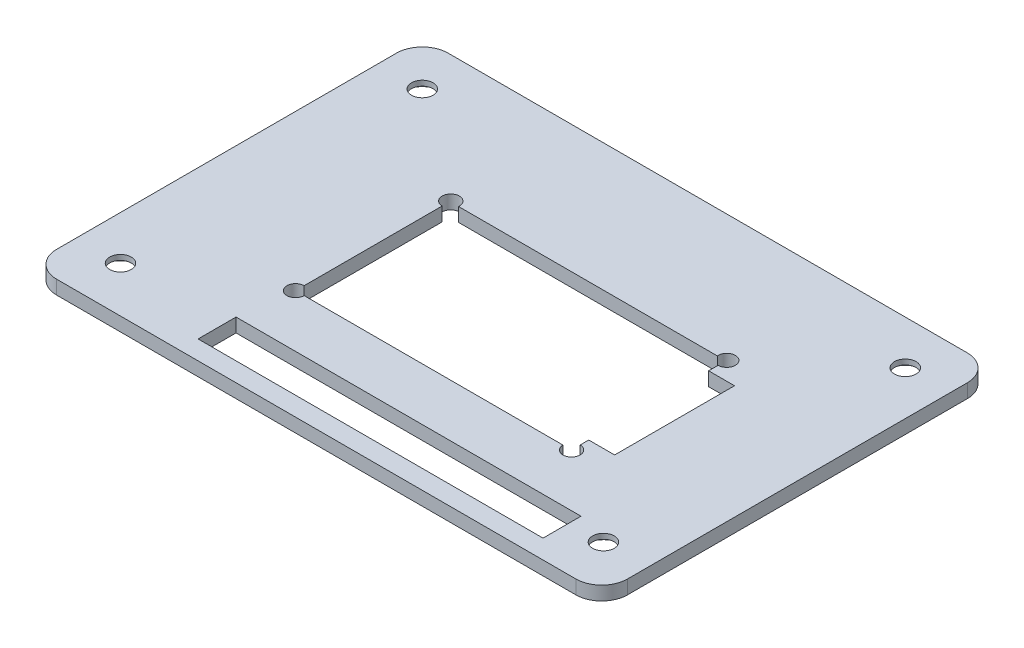
ISO-10303-21;
HEADER;
FILE_DESCRIPTION(('STEP AP214'),'2;1');
FILE_NAME('part.step','',(''),(''),'','','');
FILE_SCHEMA(('AUTOMOTIVE_DESIGN { 1 0 10303 214 1 1 1 1 }'));
ENDSEC;
DATA;
#1=APPLICATION_CONTEXT('core data for automotive mechanical design processes');
#2=APPLICATION_PROTOCOL_DEFINITION('international standard','automotive_design',2000,#1);
#3=PRODUCT_CONTEXT('',#1,'mechanical');
#4=PRODUCT('Part','Part','',(#3));
#5=PRODUCT_RELATED_PRODUCT_CATEGORY('part','',(#4));
#6=PRODUCT_DEFINITION_FORMATION('','',#4);
#7=PRODUCT_DEFINITION_CONTEXT('part definition',#1,'design');
#8=PRODUCT_DEFINITION('design','',#6,#7);
#9=PRODUCT_DEFINITION_SHAPE('','',#8);
#10=(LENGTH_UNIT() NAMED_UNIT(*) SI_UNIT(.MILLI.,.METRE.));
#11=(NAMED_UNIT(*) PLANE_ANGLE_UNIT() SI_UNIT($,.RADIAN.));
#12=(NAMED_UNIT(*) SI_UNIT($,.STERADIAN.) SOLID_ANGLE_UNIT());
#13=UNCERTAINTY_MEASURE_WITH_UNIT(LENGTH_MEASURE(1.E-05),#10,'distance_accuracy_value','');
#14=(GEOMETRIC_REPRESENTATION_CONTEXT(3) GLOBAL_UNCERTAINTY_ASSIGNED_CONTEXT((#13)) GLOBAL_UNIT_ASSIGNED_CONTEXT((#10,
#11,#12)) REPRESENTATION_CONTEXT('',''));
#15=CARTESIAN_POINT('',(0.,0.,0.));
#16=DIRECTION('',(0.,0.,1.));
#17=DIRECTION('',(1.,0.,0.));
#18=AXIS2_PLACEMENT_3D('',#15,#16,#17);
#19=CARTESIAN_POINT('',(30.1,1.6,-19.7));
#20=DIRECTION('',(0.,-1.,0.));
#21=DIRECTION('',(0.,0.,-1.));
#22=AXIS2_PLACEMENT_3D('',#19,#20,#21);
#23=CYLINDRICAL_SURFACE('',#22,3.);
#24=CARTESIAN_POINT('',(30.1,0.,-19.7));
#25=DIRECTION('',(0.,1.,0.));
#26=DIRECTION('',(0.,0.,-1.));
#27=AXIS2_PLACEMENT_3D('',#24,#25,#26);
#28=CIRCLE('',#27,3.);
#29=CARTESIAN_POINT('',(33.1,0.,-19.7));
#30=VERTEX_POINT('',#29);
#31=CARTESIAN_POINT('',(30.1,0.,-22.7));
#32=VERTEX_POINT('',#31);
#33=EDGE_CURVE('E351',#30,#32,#28,.T.);
#34=ORIENTED_EDGE('',*,*,#33,.T.);
#35=DIRECTION('',(0.,-1.,0.));
#36=VECTOR('',#35,1.);
#37=CARTESIAN_POINT('',(30.1,1.6,-22.7));
#38=LINE('',#37,#36);
#39=CARTESIAN_POINT('',(30.1,1.6,-22.7));
#40=VERTEX_POINT('',#39);
#41=EDGE_CURVE('E11',#40,#32,#38,.T.);
#42=ORIENTED_EDGE('',*,*,#41,.F.);
#43=CARTESIAN_POINT('',(30.1,1.6,-19.7));
#44=DIRECTION('',(0.,1.,0.));
#45=DIRECTION('',(0.,0.,-1.));
#46=AXIS2_PLACEMENT_3D('',#43,#44,#45);
#47=CIRCLE('',#46,3.);
#48=CARTESIAN_POINT('',(33.1,1.6,-19.7));
#49=VERTEX_POINT('',#48);
#50=EDGE_CURVE('E354',#49,#40,#47,.T.);
#51=ORIENTED_EDGE('',*,*,#50,.F.);
#52=DIRECTION('',(0.,-1.,0.));
#53=VECTOR('',#52,1.);
#54=CARTESIAN_POINT('',(33.1,1.6,-19.7));
#55=LINE('',#54,#53);
#56=EDGE_CURVE('E372',#49,#30,#55,.T.);
#57=ORIENTED_EDGE('',*,*,#56,.T.);
#58=EDGE_LOOP('',(#34,#42,#51,#57));
#59=FACE_BOUND('',#58,.T.);
#60=ADVANCED_FACE('F33',(#59),#23,.T.);
#61=CARTESIAN_POINT('',(-30.1,1.6,-22.7));
#62=DIRECTION('',(0.,0.,1.));
#63=DIRECTION('',(1.,0.,0.));
#64=AXIS2_PLACEMENT_3D('',#61,#62,#63);
#65=PLANE('',#64);
#66=DIRECTION('',(-1.,0.,0.));
#67=VECTOR('',#66,1.);
#68=CARTESIAN_POINT('',(-30.1,0.,-22.7));
#69=LINE('',#68,#67);
#70=CARTESIAN_POINT('',(-30.1,0.,-22.7));
#71=VERTEX_POINT('',#70);
#72=EDGE_CURVE('E375',#32,#71,#69,.T.);
#73=ORIENTED_EDGE('',*,*,#72,.T.);
#74=DIRECTION('',(0.,-1.,0.));
#75=VECTOR('',#74,1.);
#76=CARTESIAN_POINT('',(-30.1,1.6,-22.7));
#77=LINE('',#76,#75);
#78=CARTESIAN_POINT('',(-30.1,1.6,-22.7));
#79=VERTEX_POINT('',#78);
#80=EDGE_CURVE('E40',#79,#71,#77,.T.);
#81=ORIENTED_EDGE('',*,*,#80,.F.);
#82=DIRECTION('',(-1.,0.,0.));
#83=VECTOR('',#82,1.);
#84=CARTESIAN_POINT('',(-30.1,1.6,-22.7));
#85=LINE('',#84,#83);
#86=EDGE_CURVE('E357',#40,#79,#85,.T.);
#87=ORIENTED_EDGE('',*,*,#86,.F.);
#88=ORIENTED_EDGE('',*,*,#41,.T.);
#89=EDGE_LOOP('',(#73,#81,#87,#88));
#90=FACE_BOUND('',#89,.T.);
#91=ADVANCED_FACE('F431',(#90),#65,.F.);
#92=CARTESIAN_POINT('',(-30.1,1.6,-19.7));
#93=DIRECTION('',(0.,-1.,0.));
#94=DIRECTION('',(0.,0.,-1.));
#95=AXIS2_PLACEMENT_3D('',#92,#93,#94);
#96=CYLINDRICAL_SURFACE('',#95,3.);
#97=CARTESIAN_POINT('',(-30.1,0.,-19.7));
#98=DIRECTION('',(0.,1.,0.));
#99=DIRECTION('',(0.,0.,-1.));
#100=AXIS2_PLACEMENT_3D('',#97,#98,#99);
#101=CIRCLE('',#100,3.);
#102=CARTESIAN_POINT('',(-33.1,0.,-19.7));
#103=VERTEX_POINT('',#102);
#104=EDGE_CURVE('E377',#71,#103,#101,.T.);
#105=ORIENTED_EDGE('',*,*,#104,.T.);
#106=DIRECTION('',(0.,-1.,0.));
#107=VECTOR('',#106,1.);
#108=CARTESIAN_POINT('',(-33.1,1.6,-19.7));
#109=LINE('',#108,#107);
#110=CARTESIAN_POINT('',(-33.1,1.6,-19.7));
#111=VERTEX_POINT('',#110);
#112=EDGE_CURVE('E402',#111,#103,#109,.T.);
#113=ORIENTED_EDGE('',*,*,#112,.F.);
#114=CARTESIAN_POINT('',(-30.1,1.6,-19.7));
#115=DIRECTION('',(0.,1.,0.));
#116=DIRECTION('',(0.,0.,-1.));
#117=AXIS2_PLACEMENT_3D('',#114,#115,#116);
#118=CIRCLE('',#117,3.);
#119=EDGE_CURVE('E360',#79,#111,#118,.T.);
#120=ORIENTED_EDGE('',*,*,#119,.F.);
#121=ORIENTED_EDGE('',*,*,#80,.T.);
#122=EDGE_LOOP('',(#105,#113,#120,#121));
#123=FACE_BOUND('',#122,.T.);
#124=ADVANCED_FACE('F409',(#123),#96,.T.);
#125=CARTESIAN_POINT('',(-33.1,1.6,19.7));
#126=DIRECTION('',(1.,0.,0.));
#127=DIRECTION('',(0.,0.,-1.));
#128=AXIS2_PLACEMENT_3D('',#125,#126,#127);
#129=PLANE('',#128);
#130=DIRECTION('',(0.,0.,1.));
#131=VECTOR('',#130,1.);
#132=CARTESIAN_POINT('',(-33.1,0.,19.7));
#133=LINE('',#132,#131);
#134=CARTESIAN_POINT('',(-33.1,0.,19.7));
#135=VERTEX_POINT('',#134);
#136=EDGE_CURVE('E379',#103,#135,#133,.T.);
#137=ORIENTED_EDGE('',*,*,#136,.T.);
#138=DIRECTION('',(0.,-1.,0.));
#139=VECTOR('',#138,1.);
#140=CARTESIAN_POINT('',(-33.1,1.6,19.7));
#141=LINE('',#140,#139);
#142=CARTESIAN_POINT('',(-33.1,1.6,19.7));
#143=VERTEX_POINT('',#142);
#144=EDGE_CURVE('E399',#143,#135,#141,.T.);
#145=ORIENTED_EDGE('',*,*,#144,.F.);
#146=DIRECTION('',(0.,0.,1.));
#147=VECTOR('',#146,1.);
#148=CARTESIAN_POINT('',(-33.1,1.6,19.7));
#149=LINE('',#148,#147);
#150=EDGE_CURVE('E362',#111,#143,#149,.T.);
#151=ORIENTED_EDGE('',*,*,#150,.F.);
#152=ORIENTED_EDGE('',*,*,#112,.T.);
#153=EDGE_LOOP('',(#137,#145,#151,#152));
#154=FACE_BOUND('',#153,.T.);
#155=ADVANCED_FACE('F420',(#154),#129,.F.);
#156=CARTESIAN_POINT('',(-30.1,1.6,19.7));
#157=DIRECTION('',(0.,-1.,0.));
#158=DIRECTION('',(0.,0.,-1.));
#159=AXIS2_PLACEMENT_3D('',#156,#157,#158);
#160=CYLINDRICAL_SURFACE('',#159,3.);
#161=CARTESIAN_POINT('',(-30.1,0.,19.7));
#162=DIRECTION('',(0.,1.,0.));
#163=DIRECTION('',(0.,0.,-1.));
#164=AXIS2_PLACEMENT_3D('',#161,#162,#163);
#165=CIRCLE('',#164,3.);
#166=CARTESIAN_POINT('',(-30.1,0.,22.7));
#167=VERTEX_POINT('',#166);
#168=EDGE_CURVE('E381',#135,#167,#165,.T.);
#169=ORIENTED_EDGE('',*,*,#168,.T.);
#170=DIRECTION('',(0.,-1.,0.));
#171=VECTOR('',#170,1.);
#172=CARTESIAN_POINT('',(-30.1,1.6,22.7));
#173=LINE('',#172,#171);
#174=CARTESIAN_POINT('',(-30.1,1.6,22.7));
#175=VERTEX_POINT('',#174);
#176=EDGE_CURVE('E396',#175,#167,#173,.T.);
#177=ORIENTED_EDGE('',*,*,#176,.F.);
#178=CARTESIAN_POINT('',(-30.1,1.6,19.7));
#179=DIRECTION('',(0.,1.,0.));
#180=DIRECTION('',(0.,0.,-1.));
#181=AXIS2_PLACEMENT_3D('',#178,#179,#180);
#182=CIRCLE('',#181,3.);
#183=EDGE_CURVE('E364',#143,#175,#182,.T.);
#184=ORIENTED_EDGE('',*,*,#183,.F.);
#185=ORIENTED_EDGE('',*,*,#144,.T.);
#186=EDGE_LOOP('',(#169,#177,#184,#185));
#187=FACE_BOUND('',#186,.T.);
#188=ADVANCED_FACE('F424',(#187),#160,.T.);
#189=CARTESIAN_POINT('',(-30.1,1.6,22.7));
#190=DIRECTION('',(0.,0.,-1.));
#191=DIRECTION('',(-1.,0.,0.));
#192=AXIS2_PLACEMENT_3D('',#189,#190,#191);
#193=PLANE('',#192);
#194=DIRECTION('',(1.,0.,0.));
#195=VECTOR('',#194,1.);
#196=CARTESIAN_POINT('',(-30.1,0.,22.7));
#197=LINE('',#196,#195);
#198=CARTESIAN_POINT('',(30.1,0.,22.7));
#199=VERTEX_POINT('',#198);
#200=EDGE_CURVE('E383',#167,#199,#197,.T.);
#201=ORIENTED_EDGE('',*,*,#200,.T.);
#202=DIRECTION('',(0.,-1.,0.));
#203=VECTOR('',#202,1.);
#204=CARTESIAN_POINT('',(30.1,1.6,22.7));
#205=LINE('',#204,#203);
#206=CARTESIAN_POINT('',(30.1,1.6,22.7));
#207=VERTEX_POINT('',#206);
#208=EDGE_CURVE('E393',#207,#199,#205,.T.);
#209=ORIENTED_EDGE('',*,*,#208,.F.);
#210=DIRECTION('',(1.,0.,0.));
#211=VECTOR('',#210,1.);
#212=CARTESIAN_POINT('',(-30.1,1.6,22.7));
#213=LINE('',#212,#211);
#214=EDGE_CURVE('E366',#175,#207,#213,.T.);
#215=ORIENTED_EDGE('',*,*,#214,.F.);
#216=ORIENTED_EDGE('',*,*,#176,.T.);
#217=EDGE_LOOP('',(#201,#209,#215,#216));
#218=FACE_BOUND('',#217,.T.);
#219=ADVANCED_FACE('F444',(#218),#193,.F.);
#220=CARTESIAN_POINT('',(30.1,1.6,19.7));
#221=DIRECTION('',(0.,-1.,0.));
#222=DIRECTION('',(0.,0.,-1.));
#223=AXIS2_PLACEMENT_3D('',#220,#221,#222);
#224=CYLINDRICAL_SURFACE('',#223,3.);
#225=CARTESIAN_POINT('',(30.1,0.,19.7));
#226=DIRECTION('',(0.,1.,0.));
#227=DIRECTION('',(0.,0.,1.));
#228=AXIS2_PLACEMENT_3D('',#225,#226,#227);
#229=CIRCLE('',#228,3.);
#230=CARTESIAN_POINT('',(33.1,0.,19.7));
#231=VERTEX_POINT('',#230);
#232=EDGE_CURVE('E385',#199,#231,#229,.T.);
#233=ORIENTED_EDGE('',*,*,#232,.T.);
#234=DIRECTION('',(0.,-1.,0.));
#235=VECTOR('',#234,1.);
#236=CARTESIAN_POINT('',(33.1,1.6,19.7));
#237=LINE('',#236,#235);
#238=CARTESIAN_POINT('',(33.1,1.6,19.7));
#239=VERTEX_POINT('',#238);
#240=EDGE_CURVE('E390',#239,#231,#237,.T.);
#241=ORIENTED_EDGE('',*,*,#240,.F.);
#242=CARTESIAN_POINT('',(30.1,1.6,19.7));
#243=DIRECTION('',(0.,1.,0.));
#244=DIRECTION('',(0.,0.,1.));
#245=AXIS2_PLACEMENT_3D('',#242,#243,#244);
#246=CIRCLE('',#245,3.);
#247=EDGE_CURVE('E368',#207,#239,#246,.T.);
#248=ORIENTED_EDGE('',*,*,#247,.F.);
#249=ORIENTED_EDGE('',*,*,#208,.T.);
#250=EDGE_LOOP('',(#233,#241,#248,#249));
#251=FACE_BOUND('',#250,.T.);
#252=ADVANCED_FACE('F442',(#251),#224,.T.);
#253=CARTESIAN_POINT('',(33.1,1.6,19.7));
#254=DIRECTION('',(-1.,0.,0.));
#255=DIRECTION('',(0.,0.,1.));
#256=AXIS2_PLACEMENT_3D('',#253,#254,#255);
#257=PLANE('',#256);
#258=DIRECTION('',(0.,0.,-1.));
#259=VECTOR('',#258,1.);
#260=CARTESIAN_POINT('',(33.1,0.,19.7));
#261=LINE('',#260,#259);
#262=EDGE_CURVE('E358',#231,#30,#261,.T.);
#263=ORIENTED_EDGE('',*,*,#262,.T.);
#264=ORIENTED_EDGE('',*,*,#56,.F.);
#265=DIRECTION('',(0.,0.,-1.));
#266=VECTOR('',#265,1.);
#267=CARTESIAN_POINT('',(33.1,1.6,19.7));
#268=LINE('',#267,#266);
#269=EDGE_CURVE('E370',#239,#49,#268,.T.);
#270=ORIENTED_EDGE('',*,*,#269,.F.);
#271=ORIENTED_EDGE('',*,*,#240,.T.);
#272=EDGE_LOOP('',(#263,#264,#270,#271));
#273=FACE_BOUND('',#272,.T.);
#274=ADVANCED_FACE('F437',(#273),#257,.F.);
#275=CARTESIAN_POINT('',(30.1,1.6,-19.7));
#276=DIRECTION('',(0.,-1.,0.));
#277=DIRECTION('',(0.,0.,-1.));
#278=AXIS2_PLACEMENT_3D('',#275,#276,#277);
#279=PLANE('',#278);
#280=DIRECTION('',(0.,0.,-1.));
#281=VECTOR('',#280,1.);
#282=CARTESIAN_POINT('',(16.9000000629711,1.6,7.99999999999638));
#283=LINE('',#282,#281);
#284=CARTESIAN_POINT('',(16.9000000629711,1.6,9.00001256265664));
#285=VERTEX_POINT('',#284);
#286=CARTESIAN_POINT('',(16.9000000629711,1.6,7.99999999999638));
#287=VERTEX_POINT('',#286);
#288=EDGE_CURVE('E218',#285,#287,#283,.T.);
#289=ORIENTED_EDGE('',*,*,#288,.F.);
#290=CARTESIAN_POINT('',(16.9050125628909,1.6,10.));
#291=DIRECTION('',(0.,-1.,0.));
#292=DIRECTION('',(0.,0.,-1.));
#293=AXIS2_PLACEMENT_3D('',#290,#291,#292);
#294=CIRCLE('',#293,1.);
#295=CARTESIAN_POINT('',(15.9050125628909,1.6,9.99999999999638));
#296=VERTEX_POINT('',#295);
#297=EDGE_CURVE('E197',#296,#285,#294,.F.);
#298=ORIENTED_EDGE('',*,*,#297,.F.);
#299=DIRECTION('',(1.,0.,0.));
#300=VECTOR('',#299,1.);
#301=CARTESIAN_POINT('',(15.9050125628909,1.6,9.99999999999638));
#302=LINE('',#301,#300);
#303=CARTESIAN_POINT('',(-14.1,1.6,9.99999999999639));
#304=VERTEX_POINT('',#303);
#305=EDGE_CURVE('E208',#304,#296,#302,.T.);
#306=ORIENTED_EDGE('',*,*,#305,.F.);
#307=CARTESIAN_POINT('',(-15.1,1.6,9.99999999999999));
#308=DIRECTION('',(0.,-1.,0.));
#309=DIRECTION('',(0.,0.,-1.));
#310=AXIS2_PLACEMENT_3D('',#307,#308,#309);
#311=CIRCLE('',#310,1.);
#312=CARTESIAN_POINT('',(-15.1,1.6,8.99999999999999));
#313=VERTEX_POINT('',#312);
#314=EDGE_CURVE('E47',#313,#304,#311,.F.);
#315=ORIENTED_EDGE('',*,*,#314,.F.);
#316=DIRECTION('',(0.,0.,1.));
#317=VECTOR('',#316,1.);
#318=CARTESIAN_POINT('',(-15.1,1.6,-7.));
#319=LINE('',#318,#317);
#320=CARTESIAN_POINT('',(-15.1,1.6,-7.));
#321=VERTEX_POINT('',#320);
#322=EDGE_CURVE('E786',#321,#313,#319,.T.);
#323=ORIENTED_EDGE('',*,*,#322,.F.);
#324=CARTESIAN_POINT('',(-15.1,1.6,-8.));
#325=DIRECTION('',(0.,-1.,0.));
#326=DIRECTION('',(0.,0.,-1.));
#327=AXIS2_PLACEMENT_3D('',#324,#325,#326);
#328=CIRCLE('',#327,1.);
#329=CARTESIAN_POINT('',(-14.1050125628934,1.6,-7.9));
#330=VERTEX_POINT('',#329);
#331=EDGE_CURVE('E789',#330,#321,#328,.F.);
#332=ORIENTED_EDGE('',*,*,#331,.F.);
#333=DIRECTION('',(-1.,0.,0.));
#334=VECTOR('',#333,1.);
#335=CARTESIAN_POINT('',(15.9050125628909,1.6,-7.9));
#336=LINE('',#335,#334);
#337=CARTESIAN_POINT('',(15.9050125628909,1.6,-7.9));
#338=VERTEX_POINT('',#337);
#339=EDGE_CURVE('E794',#338,#330,#336,.T.);
#340=ORIENTED_EDGE('',*,*,#339,.F.);
#341=CARTESIAN_POINT('',(16.9,1.6,-7.99999999997577));
#342=DIRECTION('',(0.,-1.,0.));
#343=DIRECTION('',(0.,0.,-1.));
#344=AXIS2_PLACEMENT_3D('',#341,#342,#343);
#345=CIRCLE('',#344,1.);
#346=CARTESIAN_POINT('',(16.9000000629711,1.6,-6.99999999997577));
#347=VERTEX_POINT('',#346);
#348=EDGE_CURVE('E797',#347,#338,#345,.F.);
#349=ORIENTED_EDGE('',*,*,#348,.F.);
#350=DIRECTION('',(0.,0.,-1.));
#351=VECTOR('',#350,1.);
#352=CARTESIAN_POINT('',(16.9000000629711,1.6,-6.99999999997577));
#353=LINE('',#352,#351);
#354=CARTESIAN_POINT('',(16.9000000629711,1.6,-5.9));
#355=VERTEX_POINT('',#354);
#356=EDGE_CURVE('E800',#355,#347,#353,.T.);
#357=ORIENTED_EDGE('',*,*,#356,.F.);
#358=DIRECTION('',(-1.,0.,0.));
#359=VECTOR('',#358,1.);
#360=CARTESIAN_POINT('',(16.9000000629711,1.6,-5.9));
#361=LINE('',#360,#359);
#362=CARTESIAN_POINT('',(19.9000000629711,1.6,-5.9));
#363=VERTEX_POINT('',#362);
#364=EDGE_CURVE('E803',#363,#355,#361,.T.);
#365=ORIENTED_EDGE('',*,*,#364,.F.);
#366=DIRECTION('',(0.,0.,-1.));
#367=VECTOR('',#366,1.);
#368=CARTESIAN_POINT('',(19.9000000629711,1.6,7.99999999999638));
#369=LINE('',#368,#367);
#370=CARTESIAN_POINT('',(19.9000000629711,1.6,7.99999999999638));
#371=VERTEX_POINT('',#370);
#372=EDGE_CURVE('E806',#371,#363,#369,.T.);
#373=ORIENTED_EDGE('',*,*,#372,.F.);
#374=DIRECTION('',(1.,0.,0.));
#375=VECTOR('',#374,1.);
#376=CARTESIAN_POINT('',(16.9000000629711,1.6,7.99999999999638));
#377=LINE('',#376,#375);
#378=EDGE_CURVE('E222',#287,#371,#377,.T.);
#379=ORIENTED_EDGE('',*,*,#378,.F.);
#380=EDGE_LOOP('',(#289,#298,#306,#315,#323,#332,#340,#349,#357,#365,#373,#379));
#381=FACE_BOUND('',#380,.T.);
#382=DIRECTION('',(1.,0.,0.));
#383=VECTOR('',#382,1.);
#384=CARTESIAN_POINT('',(-15.9,1.6,20.5));
#385=LINE('',#384,#383);
#386=CARTESIAN_POINT('',(-15.9,1.6,20.5));
#387=VERTEX_POINT('',#386);
#388=CARTESIAN_POINT('',(24.1,1.6,20.5));
#389=VERTEX_POINT('',#388);
#390=EDGE_CURVE('E277',#387,#389,#385,.T.);
#391=ORIENTED_EDGE('',*,*,#390,.F.);
#392=DIRECTION('',(0.,0.,1.));
#393=VECTOR('',#392,1.);
#394=CARTESIAN_POINT('',(-15.9,1.6,20.5));
#395=LINE('',#394,#393);
#396=CARTESIAN_POINT('',(-15.9,1.6,16.1));
#397=VERTEX_POINT('',#396);
#398=EDGE_CURVE('E280',#397,#387,#395,.T.);
#399=ORIENTED_EDGE('',*,*,#398,.F.);
#400=DIRECTION('',(-1.,0.,0.));
#401=VECTOR('',#400,1.);
#402=CARTESIAN_POINT('',(-15.9,1.6,16.1));
#403=LINE('',#402,#401);
#404=CARTESIAN_POINT('',(24.1,1.6,16.1));
#405=VERTEX_POINT('',#404);
#406=EDGE_CURVE('E297',#405,#397,#403,.T.);
#407=ORIENTED_EDGE('',*,*,#406,.F.);
#408=DIRECTION('',(0.,0.,-1.));
#409=VECTOR('',#408,1.);
#410=CARTESIAN_POINT('',(24.1,1.6,20.5));
#411=LINE('',#410,#409);
#412=EDGE_CURVE('E55',#389,#405,#411,.T.);
#413=ORIENTED_EDGE('',*,*,#412,.F.);
#414=EDGE_LOOP('',(#391,#399,#407,#413));
#415=FACE_BOUND('',#414,.T.);
#416=CARTESIAN_POINT('',(-28.0000000000001,1.6,17.4));
#417=DIRECTION('',(0.,-1.,0.));
#418=DIRECTION('',(0.,0.,-1.));
#419=AXIS2_PLACEMENT_3D('',#416,#417,#418);
#420=CIRCLE('',#419,1.25);
#421=CARTESIAN_POINT('',(-28.0000000000001,1.6,16.15));
#422=VERTEX_POINT('',#421);
#423=EDGE_CURVE('E317',#422,#422,#420,.F.);
#424=ORIENTED_EDGE('',*,*,#423,.F.);
#425=EDGE_LOOP('',(#424));
#426=FACE_BOUND('',#425,.T.);
#427=CARTESIAN_POINT('',(27.9999999999999,1.6,17.4));
#428=DIRECTION('',(0.,-1.,0.));
#429=DIRECTION('',(0.,0.,-1.));
#430=AXIS2_PLACEMENT_3D('',#427,#428,#429);
#431=CIRCLE('',#430,1.25);
#432=CARTESIAN_POINT('',(27.9999999999999,1.6,16.15));
#433=VERTEX_POINT('',#432);
#434=EDGE_CURVE('E310',#433,#433,#431,.F.);
#435=ORIENTED_EDGE('',*,*,#434,.F.);
#436=EDGE_LOOP('',(#435));
#437=FACE_BOUND('',#436,.T.);
#438=CARTESIAN_POINT('',(28.,1.6,-17.6));
#439=DIRECTION('',(0.,-1.,0.));
#440=DIRECTION('',(0.,0.,-1.));
#441=AXIS2_PLACEMENT_3D('',#438,#439,#440);
#442=CIRCLE('',#441,1.25);
#443=CARTESIAN_POINT('',(28.,1.6,-18.85));
#444=VERTEX_POINT('',#443);
#445=EDGE_CURVE('E309',#444,#444,#442,.F.);
#446=ORIENTED_EDGE('',*,*,#445,.F.);
#447=EDGE_LOOP('',(#446));
#448=FACE_BOUND('',#447,.T.);
#449=CARTESIAN_POINT('',(-28.,1.6,-17.6));
#450=DIRECTION('',(0.,-1.,0.));
#451=DIRECTION('',(0.,0.,-1.));
#452=AXIS2_PLACEMENT_3D('',#449,#450,#451);
#453=CIRCLE('',#452,1.25);
#454=CARTESIAN_POINT('',(-28.,1.6,-18.85));
#455=VERTEX_POINT('',#454);
#456=EDGE_CURVE('E326',#455,#455,#453,.F.);
#457=ORIENTED_EDGE('',*,*,#456,.F.);
#458=EDGE_LOOP('',(#457));
#459=FACE_BOUND('',#458,.T.);
#460=ORIENTED_EDGE('',*,*,#50,.T.);
#461=ORIENTED_EDGE('',*,*,#86,.T.);
#462=ORIENTED_EDGE('',*,*,#119,.T.);
#463=ORIENTED_EDGE('',*,*,#150,.T.);
#464=ORIENTED_EDGE('',*,*,#183,.T.);
#465=ORIENTED_EDGE('',*,*,#214,.T.);
#466=ORIENTED_EDGE('',*,*,#247,.T.);
#467=ORIENTED_EDGE('',*,*,#269,.T.);
#468=EDGE_LOOP('',(#460,#461,#462,#463,#464,#465,#466,#467));
#469=FACE_BOUND('',#468,.T.);
#470=ADVANCED_FACE('F214',(#381,#415,#426,#437,#448,#459,#469),#279,.F.);
#471=CARTESIAN_POINT('',(30.1,0.,-19.7));
#472=DIRECTION('',(0.,-1.,0.));
#473=DIRECTION('',(0.,0.,-1.));
#474=AXIS2_PLACEMENT_3D('',#471,#472,#473);
#475=PLANE('',#474);
#476=CARTESIAN_POINT('',(16.9050125628909,0.,10.));
#477=DIRECTION('',(0.,-1.,0.));
#478=DIRECTION('',(0.,0.,-1.));
#479=AXIS2_PLACEMENT_3D('',#476,#477,#478);
#480=CIRCLE('',#479,1.);
#481=CARTESIAN_POINT('',(16.9000000629711,0.,9.00001256265664));
#482=VERTEX_POINT('',#481);
#483=CARTESIAN_POINT('',(15.9050125628909,0.,9.99999999999638));
#484=VERTEX_POINT('',#483);
#485=EDGE_CURVE('E200',#482,#484,#480,.T.);
#486=ORIENTED_EDGE('',*,*,#485,.F.);
#487=DIRECTION('',(0.,0.,1.));
#488=VECTOR('',#487,1.);
#489=CARTESIAN_POINT('',(16.9000000629711,0.,7.99999999999638));
#490=LINE('',#489,#488);
#491=CARTESIAN_POINT('',(16.9000000629711,0.,7.99999999999638));
#492=VERTEX_POINT('',#491);
#493=EDGE_CURVE('E205',#492,#482,#490,.T.);
#494=ORIENTED_EDGE('',*,*,#493,.F.);
#495=DIRECTION('',(-1.,0.,0.));
#496=VECTOR('',#495,1.);
#497=CARTESIAN_POINT('',(16.9000000629711,0.,7.99999999999638));
#498=LINE('',#497,#496);
#499=CARTESIAN_POINT('',(19.9000000629711,0.,7.99999999999638));
#500=VERTEX_POINT('',#499);
#501=EDGE_CURVE('E251',#500,#492,#498,.T.);
#502=ORIENTED_EDGE('',*,*,#501,.F.);
#503=DIRECTION('',(0.,0.,1.));
#504=VECTOR('',#503,1.);
#505=CARTESIAN_POINT('',(19.9000000629711,0.,7.99999999999638));
#506=LINE('',#505,#504);
#507=CARTESIAN_POINT('',(19.9000000629711,0.,-5.9));
#508=VERTEX_POINT('',#507);
#509=EDGE_CURVE('E248',#508,#500,#506,.T.);
#510=ORIENTED_EDGE('',*,*,#509,.F.);
#511=DIRECTION('',(1.,0.,0.));
#512=VECTOR('',#511,1.);
#513=CARTESIAN_POINT('',(16.9000000629711,0.,-5.9));
#514=LINE('',#513,#512);
#515=CARTESIAN_POINT('',(16.9000000629711,0.,-5.9));
#516=VERTEX_POINT('',#515);
#517=EDGE_CURVE('E245',#516,#508,#514,.T.);
#518=ORIENTED_EDGE('',*,*,#517,.F.);
#519=DIRECTION('',(0.,0.,1.));
#520=VECTOR('',#519,1.);
#521=CARTESIAN_POINT('',(16.9000000629711,0.,-6.99999999997577));
#522=LINE('',#521,#520);
#523=CARTESIAN_POINT('',(16.9000000629711,0.,-6.99999999997577));
#524=VERTEX_POINT('',#523);
#525=EDGE_CURVE('E242',#524,#516,#522,.T.);
#526=ORIENTED_EDGE('',*,*,#525,.F.);
#527=CARTESIAN_POINT('',(16.9,0.,-7.99999999997577));
#528=DIRECTION('',(0.,-1.,0.));
#529=DIRECTION('',(0.,0.,-1.));
#530=AXIS2_PLACEMENT_3D('',#527,#528,#529);
#531=CIRCLE('',#530,1.);
#532=CARTESIAN_POINT('',(15.9050125628909,0.,-7.9));
#533=VERTEX_POINT('',#532);
#534=EDGE_CURVE('E239',#533,#524,#531,.T.);
#535=ORIENTED_EDGE('',*,*,#534,.F.);
#536=DIRECTION('',(1.,0.,0.));
#537=VECTOR('',#536,1.);
#538=CARTESIAN_POINT('',(15.9050125628909,0.,-7.9));
#539=LINE('',#538,#537);
#540=CARTESIAN_POINT('',(-14.1050125628934,0.,-7.9));
#541=VERTEX_POINT('',#540);
#542=EDGE_CURVE('E236',#541,#533,#539,.T.);
#543=ORIENTED_EDGE('',*,*,#542,.F.);
#544=CARTESIAN_POINT('',(-15.1,0.,-8.));
#545=DIRECTION('',(0.,-1.,0.));
#546=DIRECTION('',(0.,0.,-1.));
#547=AXIS2_PLACEMENT_3D('',#544,#545,#546);
#548=CIRCLE('',#547,1.);
#549=CARTESIAN_POINT('',(-15.1,0.,-7.));
#550=VERTEX_POINT('',#549);
#551=EDGE_CURVE('E233',#550,#541,#548,.T.);
#552=ORIENTED_EDGE('',*,*,#551,.F.);
#553=DIRECTION('',(0.,0.,-1.));
#554=VECTOR('',#553,1.);
#555=CARTESIAN_POINT('',(-15.1,0.,-7.));
#556=LINE('',#555,#554);
#557=CARTESIAN_POINT('',(-15.1,0.,8.99999999999999));
#558=VERTEX_POINT('',#557);
#559=EDGE_CURVE('E230',#558,#550,#556,.T.);
#560=ORIENTED_EDGE('',*,*,#559,.F.);
#561=CARTESIAN_POINT('',(-15.1,0.,9.99999999999999));
#562=DIRECTION('',(0.,-1.,0.));
#563=DIRECTION('',(0.,0.,-1.));
#564=AXIS2_PLACEMENT_3D('',#561,#562,#563);
#565=CIRCLE('',#564,1.);
#566=CARTESIAN_POINT('',(-14.1,0.,9.99999999999638));
#567=VERTEX_POINT('',#566);
#568=EDGE_CURVE('E227',#567,#558,#565,.T.);
#569=ORIENTED_EDGE('',*,*,#568,.F.);
#570=DIRECTION('',(-1.,0.,0.));
#571=VECTOR('',#570,1.);
#572=CARTESIAN_POINT('',(15.9050125628909,0.,9.99999999999638));
#573=LINE('',#572,#571);
#574=EDGE_CURVE('E220',#484,#567,#573,.T.);
#575=ORIENTED_EDGE('',*,*,#574,.F.);
#576=EDGE_LOOP('',(#486,#494,#502,#510,#518,#526,#535,#543,#552,#560,#569,#575));
#577=FACE_BOUND('',#576,.T.);
#578=DIRECTION('',(0.,0.,-1.));
#579=VECTOR('',#578,1.);
#580=CARTESIAN_POINT('',(-15.9,0.,20.5));
#581=LINE('',#580,#579);
#582=CARTESIAN_POINT('',(-15.9,0.,20.5));
#583=VERTEX_POINT('',#582);
#584=CARTESIAN_POINT('',(-15.9,0.,16.1));
#585=VERTEX_POINT('',#584);
#586=EDGE_CURVE('E283',#583,#585,#581,.T.);
#587=ORIENTED_EDGE('',*,*,#586,.F.);
#588=DIRECTION('',(-1.,0.,0.));
#589=VECTOR('',#588,1.);
#590=CARTESIAN_POINT('',(-15.9,0.,20.5));
#591=LINE('',#590,#589);
#592=CARTESIAN_POINT('',(24.1,0.,20.5));
#593=VERTEX_POINT('',#592);
#594=EDGE_CURVE('E291',#593,#583,#591,.T.);
#595=ORIENTED_EDGE('',*,*,#594,.F.);
#596=DIRECTION('',(0.,0.,1.));
#597=VECTOR('',#596,1.);
#598=CARTESIAN_POINT('',(24.1,0.,20.5));
#599=LINE('',#598,#597);
#600=CARTESIAN_POINT('',(24.1,0.,16.1));
#601=VERTEX_POINT('',#600);
#602=EDGE_CURVE('E288',#601,#593,#599,.T.);
#603=ORIENTED_EDGE('',*,*,#602,.F.);
#604=DIRECTION('',(1.,0.,0.));
#605=VECTOR('',#604,1.);
#606=CARTESIAN_POINT('',(-15.9,0.,16.1));
#607=LINE('',#606,#605);
#608=EDGE_CURVE('E285',#585,#601,#607,.T.);
#609=ORIENTED_EDGE('',*,*,#608,.F.);
#610=EDGE_LOOP('',(#587,#595,#603,#609));
#611=FACE_BOUND('',#610,.T.);
#612=CARTESIAN_POINT('',(-28.0000000000001,0.,17.4));
#613=DIRECTION('',(0.,-1.,0.));
#614=DIRECTION('',(0.,0.,-1.));
#615=AXIS2_PLACEMENT_3D('',#612,#613,#614);
#616=CIRCLE('',#615,2.6);
#617=CARTESIAN_POINT('',(-28.0000000000001,0.,14.8));
#618=VERTEX_POINT('',#617);
#619=EDGE_CURVE('E329',#618,#618,#616,.T.);
#620=ORIENTED_EDGE('',*,*,#619,.F.);
#621=EDGE_LOOP('',(#620));
#622=FACE_BOUND('',#621,.T.);
#623=CARTESIAN_POINT('',(27.9999999999999,0.,17.4));
#624=DIRECTION('',(0.,-1.,0.));
#625=DIRECTION('',(0.,0.,-1.));
#626=AXIS2_PLACEMENT_3D('',#623,#624,#625);
#627=CIRCLE('',#626,2.6);
#628=CARTESIAN_POINT('',(27.9999999999999,0.,14.8));
#629=VERTEX_POINT('',#628);
#630=EDGE_CURVE('E340',#629,#629,#627,.T.);
#631=ORIENTED_EDGE('',*,*,#630,.F.);
#632=EDGE_LOOP('',(#631));
#633=FACE_BOUND('',#632,.T.);
#634=CARTESIAN_POINT('',(28.,0.,-17.6));
#635=DIRECTION('',(0.,-1.,0.));
#636=DIRECTION('',(0.,0.,-1.));
#637=AXIS2_PLACEMENT_3D('',#634,#635,#636);
#638=CIRCLE('',#637,2.6);
#639=CARTESIAN_POINT('',(28.,0.,-20.2));
#640=VERTEX_POINT('',#639);
#641=EDGE_CURVE('E334',#640,#640,#638,.T.);
#642=ORIENTED_EDGE('',*,*,#641,.F.);
#643=EDGE_LOOP('',(#642));
#644=FACE_BOUND('',#643,.T.);
#645=CARTESIAN_POINT('',(-28.,0.,-17.6));
#646=DIRECTION('',(0.,-1.,0.));
#647=DIRECTION('',(0.,0.,-1.));
#648=AXIS2_PLACEMENT_3D('',#645,#646,#647);
#649=CIRCLE('',#648,2.6);
#650=CARTESIAN_POINT('',(-28.,0.,-20.2));
#651=VERTEX_POINT('',#650);
#652=EDGE_CURVE('E333',#651,#651,#649,.T.);
#653=ORIENTED_EDGE('',*,*,#652,.F.);
#654=EDGE_LOOP('',(#653));
#655=FACE_BOUND('',#654,.T.);
#656=ORIENTED_EDGE('',*,*,#33,.F.);
#657=ORIENTED_EDGE('',*,*,#262,.F.);
#658=ORIENTED_EDGE('',*,*,#232,.F.);
#659=ORIENTED_EDGE('',*,*,#200,.F.);
#660=ORIENTED_EDGE('',*,*,#168,.F.);
#661=ORIENTED_EDGE('',*,*,#136,.F.);
#662=ORIENTED_EDGE('',*,*,#104,.F.);
#663=ORIENTED_EDGE('',*,*,#72,.F.);
#664=EDGE_LOOP('',(#656,#657,#658,#659,#660,#661,#662,#663));
#665=FACE_BOUND('',#664,.T.);
#666=ADVANCED_FACE('F415',(#577,#611,#622,#633,#644,#655,#665),#475,.T.);
#667=CARTESIAN_POINT('',(-28.,1.,-17.6));
#668=DIRECTION('',(0.,-1.,0.));
#669=DIRECTION('',(0.,0.,-1.));
#670=AXIS2_PLACEMENT_3D('',#667,#668,#669);
#671=CYLINDRICAL_SURFACE('',#670,2.6);
#672=CARTESIAN_POINT('',(-28.,1.,-17.6));
#673=DIRECTION('',(0.,-1.,0.));
#674=DIRECTION('',(0.,0.,-1.));
#675=AXIS2_PLACEMENT_3D('',#672,#673,#674);
#676=CIRCLE('',#675,2.6);
#677=CARTESIAN_POINT('',(-28.,1.,-20.2));
#678=VERTEX_POINT('',#677);
#679=EDGE_CURVE('E348',#678,#678,#676,.T.);
#680=ORIENTED_EDGE('',*,*,#679,.F.);
#681=EDGE_LOOP('',(#680));
#682=FACE_BOUND('',#681,.T.);
#683=ORIENTED_EDGE('',*,*,#652,.T.);
#684=EDGE_LOOP('',(#683));
#685=FACE_BOUND('',#684,.T.);
#686=ADVANCED_FACE('F496',(#682,#685),#671,.F.);
#687=CARTESIAN_POINT('',(-28.,1.,-17.6));
#688=DIRECTION('',(0.,-1.,0.));
#689=DIRECTION('',(0.,0.,-1.));
#690=AXIS2_PLACEMENT_3D('',#687,#688,#689);
#691=PLANE('',#690);
#692=CARTESIAN_POINT('',(-28.,1.,-17.6));
#693=DIRECTION('',(0.,-1.,0.));
#694=DIRECTION('',(0.,0.,-1.));
#695=AXIS2_PLACEMENT_3D('',#692,#693,#694);
#696=CIRCLE('',#695,1.25);
#697=CARTESIAN_POINT('',(-28.,1.,-18.85));
#698=VERTEX_POINT('',#697);
#699=EDGE_CURVE('E313',#698,#698,#696,.T.);
#700=ORIENTED_EDGE('',*,*,#699,.F.);
#701=EDGE_LOOP('',(#700));
#702=FACE_BOUND('',#701,.T.);
#703=ORIENTED_EDGE('',*,*,#679,.T.);
#704=EDGE_LOOP('',(#703));
#705=FACE_BOUND('',#704,.T.);
#706=ADVANCED_FACE('F501',(#702,#705),#691,.T.);
#707=CARTESIAN_POINT('',(28.,1.,-17.6));
#708=DIRECTION('',(0.,-1.,0.));
#709=DIRECTION('',(0.,0.,-1.));
#710=AXIS2_PLACEMENT_3D('',#707,#708,#709);
#711=CYLINDRICAL_SURFACE('',#710,2.6);
#712=CARTESIAN_POINT('',(28.,1.,-17.6));
#713=DIRECTION('',(0.,-1.,0.));
#714=DIRECTION('',(0.,0.,-1.));
#715=AXIS2_PLACEMENT_3D('',#712,#713,#714);
#716=CIRCLE('',#715,2.6);
#717=CARTESIAN_POINT('',(28.,1.,-20.2));
#718=VERTEX_POINT('',#717);
#719=EDGE_CURVE('E330',#718,#718,#716,.T.);
#720=ORIENTED_EDGE('',*,*,#719,.F.);
#721=EDGE_LOOP('',(#720));
#722=FACE_BOUND('',#721,.T.);
#723=ORIENTED_EDGE('',*,*,#641,.T.);
#724=EDGE_LOOP('',(#723));
#725=FACE_BOUND('',#724,.T.);
#726=ADVANCED_FACE('F511',(#722,#725),#711,.F.);
#727=CARTESIAN_POINT('',(28.,1.,-17.6));
#728=DIRECTION('',(0.,-1.,0.));
#729=DIRECTION('',(0.,0.,-1.));
#730=AXIS2_PLACEMENT_3D('',#727,#728,#729);
#731=PLANE('',#730);
#732=CARTESIAN_POINT('',(28.,1.,-17.6));
#733=DIRECTION('',(0.,-1.,0.));
#734=DIRECTION('',(0.,0.,-1.));
#735=AXIS2_PLACEMENT_3D('',#732,#733,#734);
#736=CIRCLE('',#735,1.25);
#737=CARTESIAN_POINT('',(28.,1.,-18.85));
#738=VERTEX_POINT('',#737);
#739=EDGE_CURVE('E306',#738,#738,#736,.T.);
#740=ORIENTED_EDGE('',*,*,#739,.F.);
#741=EDGE_LOOP('',(#740));
#742=FACE_BOUND('',#741,.T.);
#743=ORIENTED_EDGE('',*,*,#719,.T.);
#744=EDGE_LOOP('',(#743));
#745=FACE_BOUND('',#744,.T.);
#746=ADVANCED_FACE('F516',(#742,#745),#731,.T.);
#747=CARTESIAN_POINT('',(27.9999999999999,1.,17.4));
#748=DIRECTION('',(0.,-1.,0.));
#749=DIRECTION('',(0.,0.,-1.));
#750=AXIS2_PLACEMENT_3D('',#747,#748,#749);
#751=CYLINDRICAL_SURFACE('',#750,2.6);
#752=CARTESIAN_POINT('',(27.9999999999999,1.,17.4));
#753=DIRECTION('',(0.,-1.,0.));
#754=DIRECTION('',(0.,0.,-1.));
#755=AXIS2_PLACEMENT_3D('',#752,#753,#754);
#756=CIRCLE('',#755,2.6);
#757=CARTESIAN_POINT('',(27.9999999999999,1.,14.8));
#758=VERTEX_POINT('',#757);
#759=EDGE_CURVE('E337',#758,#758,#756,.T.);
#760=ORIENTED_EDGE('',*,*,#759,.F.);
#761=EDGE_LOOP('',(#760));
#762=FACE_BOUND('',#761,.T.);
#763=ORIENTED_EDGE('',*,*,#630,.T.);
#764=EDGE_LOOP('',(#763));
#765=FACE_BOUND('',#764,.T.);
#766=ADVANCED_FACE('F524',(#762,#765),#751,.F.);
#767=CARTESIAN_POINT('',(27.9999999999999,1.,17.4));
#768=DIRECTION('',(0.,-1.,0.));
#769=DIRECTION('',(0.,0.,-1.));
#770=AXIS2_PLACEMENT_3D('',#767,#768,#769);
#771=PLANE('',#770);
#772=CARTESIAN_POINT('',(27.9999999999999,1.,17.4));
#773=DIRECTION('',(0.,-1.,0.));
#774=DIRECTION('',(0.,0.,-1.));
#775=AXIS2_PLACEMENT_3D('',#772,#773,#774);
#776=CIRCLE('',#775,1.25);
#777=CARTESIAN_POINT('',(27.9999999999999,1.,16.15));
#778=VERTEX_POINT('',#777);
#779=EDGE_CURVE('E314',#778,#778,#776,.T.);
#780=ORIENTED_EDGE('',*,*,#779,.F.);
#781=EDGE_LOOP('',(#780));
#782=FACE_BOUND('',#781,.T.);
#783=ORIENTED_EDGE('',*,*,#759,.T.);
#784=EDGE_LOOP('',(#783));
#785=FACE_BOUND('',#784,.T.);
#786=ADVANCED_FACE('F529',(#782,#785),#771,.T.);
#787=CARTESIAN_POINT('',(-28.0000000000001,1.,17.4));
#788=DIRECTION('',(0.,-1.,0.));
#789=DIRECTION('',(0.,0.,-1.));
#790=AXIS2_PLACEMENT_3D('',#787,#788,#789);
#791=CYLINDRICAL_SURFACE('',#790,2.6);
#792=CARTESIAN_POINT('',(-28.0000000000001,1.,17.4));
#793=DIRECTION('',(0.,-1.,0.));
#794=DIRECTION('',(0.,0.,-1.));
#795=AXIS2_PLACEMENT_3D('',#792,#793,#794);
#796=CIRCLE('',#795,2.6);
#797=CARTESIAN_POINT('',(-28.0000000000001,1.,14.8));
#798=VERTEX_POINT('',#797);
#799=EDGE_CURVE('E343',#798,#798,#796,.T.);
#800=ORIENTED_EDGE('',*,*,#799,.F.);
#801=EDGE_LOOP('',(#800));
#802=FACE_BOUND('',#801,.T.);
#803=ORIENTED_EDGE('',*,*,#619,.T.);
#804=EDGE_LOOP('',(#803));
#805=FACE_BOUND('',#804,.T.);
#806=ADVANCED_FACE('F537',(#802,#805),#791,.F.);
#807=CARTESIAN_POINT('',(-28.0000000000001,1.,17.4));
#808=DIRECTION('',(0.,-1.,0.));
#809=DIRECTION('',(0.,0.,-1.));
#810=AXIS2_PLACEMENT_3D('',#807,#808,#809);
#811=PLANE('',#810);
#812=CARTESIAN_POINT('',(-28.0000000000001,1.,17.4));
#813=DIRECTION('',(0.,-1.,0.));
#814=DIRECTION('',(0.,0.,-1.));
#815=AXIS2_PLACEMENT_3D('',#812,#813,#814);
#816=CIRCLE('',#815,1.25);
#817=CARTESIAN_POINT('',(-28.0000000000001,1.,16.15));
#818=VERTEX_POINT('',#817);
#819=EDGE_CURVE('E211',#818,#818,#816,.T.);
#820=ORIENTED_EDGE('',*,*,#819,.F.);
#821=EDGE_LOOP('',(#820));
#822=FACE_BOUND('',#821,.T.);
#823=ORIENTED_EDGE('',*,*,#799,.T.);
#824=EDGE_LOOP('',(#823));
#825=FACE_BOUND('',#824,.T.);
#826=ADVANCED_FACE('F542',(#822,#825),#811,.T.);
#827=CARTESIAN_POINT('',(-28.,1.601,-17.6));
#828=DIRECTION('',(0.,-1.,0.));
#829=DIRECTION('',(0.,0.,-1.));
#830=AXIS2_PLACEMENT_3D('',#827,#828,#829);
#831=CYLINDRICAL_SURFACE('',#830,1.25);
#832=ORIENTED_EDGE('',*,*,#699,.T.);
#833=EDGE_LOOP('',(#832));
#834=FACE_BOUND('',#833,.T.);
#835=ORIENTED_EDGE('',*,*,#456,.T.);
#836=EDGE_LOOP('',(#835));
#837=FACE_BOUND('',#836,.T.);
#838=ADVANCED_FACE('F573',(#834,#837),#831,.F.);
#839=CARTESIAN_POINT('',(28.,1.601,-17.6));
#840=DIRECTION('',(0.,-1.,0.));
#841=DIRECTION('',(0.,0.,-1.));
#842=AXIS2_PLACEMENT_3D('',#839,#840,#841);
#843=CYLINDRICAL_SURFACE('',#842,1.25);
#844=ORIENTED_EDGE('',*,*,#739,.T.);
#845=EDGE_LOOP('',(#844));
#846=FACE_BOUND('',#845,.T.);
#847=ORIENTED_EDGE('',*,*,#445,.T.);
#848=EDGE_LOOP('',(#847));
#849=FACE_BOUND('',#848,.T.);
#850=ADVANCED_FACE('F583',(#846,#849),#843,.F.);
#851=CARTESIAN_POINT('',(27.9999999999999,1.601,17.4));
#852=DIRECTION('',(0.,-1.,0.));
#853=DIRECTION('',(0.,0.,-1.));
#854=AXIS2_PLACEMENT_3D('',#851,#852,#853);
#855=CYLINDRICAL_SURFACE('',#854,1.25);
#856=ORIENTED_EDGE('',*,*,#779,.T.);
#857=EDGE_LOOP('',(#856));
#858=FACE_BOUND('',#857,.T.);
#859=ORIENTED_EDGE('',*,*,#434,.T.);
#860=EDGE_LOOP('',(#859));
#861=FACE_BOUND('',#860,.T.);
#862=ADVANCED_FACE('F593',(#858,#861),#855,.F.);
#863=CARTESIAN_POINT('',(-28.0000000000001,1.601,17.4));
#864=DIRECTION('',(0.,-1.,0.));
#865=DIRECTION('',(0.,0.,-1.));
#866=AXIS2_PLACEMENT_3D('',#863,#864,#865);
#867=CYLINDRICAL_SURFACE('',#866,1.25);
#868=ORIENTED_EDGE('',*,*,#819,.T.);
#869=EDGE_LOOP('',(#868));
#870=FACE_BOUND('',#869,.T.);
#871=ORIENTED_EDGE('',*,*,#423,.T.);
#872=EDGE_LOOP('',(#871));
#873=FACE_BOUND('',#872,.T.);
#874=ADVANCED_FACE('F603',(#870,#873),#867,.F.);
#875=CARTESIAN_POINT('',(-15.9,1.601,20.5));
#876=DIRECTION('',(-1.,0.,0.));
#877=DIRECTION('',(0.,0.,1.));
#878=AXIS2_PLACEMENT_3D('',#875,#876,#877);
#879=PLANE('',#878);
#880=ORIENTED_EDGE('',*,*,#398,.T.);
#881=DIRECTION('',(0.,-1.,0.));
#882=VECTOR('',#881,1.);
#883=CARTESIAN_POINT('',(-15.9,1.601,20.5));
#884=LINE('',#883,#882);
#885=EDGE_CURVE('E295',#387,#583,#884,.T.);
#886=ORIENTED_EDGE('',*,*,#885,.T.);
#887=ORIENTED_EDGE('',*,*,#586,.T.);
#888=DIRECTION('',(0.,-1.,0.));
#889=VECTOR('',#888,1.);
#890=CARTESIAN_POINT('',(-15.9,1.601,16.1));
#891=LINE('',#890,#889);
#892=EDGE_CURVE('E294',#397,#585,#891,.T.);
#893=ORIENTED_EDGE('',*,*,#892,.F.);
#894=EDGE_LOOP('',(#880,#886,#887,#893));
#895=FACE_BOUND('',#894,.T.);
#896=ADVANCED_FACE('F613',(#895),#879,.F.);
#897=CARTESIAN_POINT('',(-15.9,1.601,20.5));
#898=DIRECTION('',(0.,0.,1.));
#899=DIRECTION('',(1.,0.,0.));
#900=AXIS2_PLACEMENT_3D('',#897,#898,#899);
#901=PLANE('',#900);
#902=ORIENTED_EDGE('',*,*,#390,.T.);
#903=DIRECTION('',(0.,-1.,0.));
#904=VECTOR('',#903,1.);
#905=CARTESIAN_POINT('',(24.1,1.601,20.5));
#906=LINE('',#905,#904);
#907=EDGE_CURVE('E298',#389,#593,#906,.T.);
#908=ORIENTED_EDGE('',*,*,#907,.T.);
#909=ORIENTED_EDGE('',*,*,#594,.T.);
#910=ORIENTED_EDGE('',*,*,#885,.F.);
#911=EDGE_LOOP('',(#902,#908,#909,#910));
#912=FACE_BOUND('',#911,.T.);
#913=ADVANCED_FACE('F636',(#912),#901,.F.);
#914=CARTESIAN_POINT('',(24.1,1.601,20.5));
#915=DIRECTION('',(1.,0.,0.));
#916=DIRECTION('',(0.,0.,-1.));
#917=AXIS2_PLACEMENT_3D('',#914,#915,#916);
#918=PLANE('',#917);
#919=ORIENTED_EDGE('',*,*,#412,.T.);
#920=DIRECTION('',(0.,-1.,0.));
#921=VECTOR('',#920,1.);
#922=CARTESIAN_POINT('',(24.1,1.601,16.1));
#923=LINE('',#922,#921);
#924=EDGE_CURVE('E300',#405,#601,#923,.T.);
#925=ORIENTED_EDGE('',*,*,#924,.T.);
#926=ORIENTED_EDGE('',*,*,#602,.T.);
#927=ORIENTED_EDGE('',*,*,#907,.F.);
#928=EDGE_LOOP('',(#919,#925,#926,#927));
#929=FACE_BOUND('',#928,.T.);
#930=ADVANCED_FACE('F646',(#929),#918,.F.);
#931=CARTESIAN_POINT('',(-15.9,1.601,16.1));
#932=DIRECTION('',(0.,0.,-1.));
#933=DIRECTION('',(-1.,0.,0.));
#934=AXIS2_PLACEMENT_3D('',#931,#932,#933);
#935=PLANE('',#934);
#936=ORIENTED_EDGE('',*,*,#406,.T.);
#937=ORIENTED_EDGE('',*,*,#892,.T.);
#938=ORIENTED_EDGE('',*,*,#608,.T.);
#939=ORIENTED_EDGE('',*,*,#924,.F.);
#940=EDGE_LOOP('',(#936,#937,#938,#939));
#941=FACE_BOUND('',#940,.T.);
#942=ADVANCED_FACE('F656',(#941),#935,.F.);
#943=CARTESIAN_POINT('',(16.9050125628909,1.601,10.));
#944=DIRECTION('',(0.,-1.,0.));
#945=DIRECTION('',(0.,0.,-1.));
#946=AXIS2_PLACEMENT_3D('',#943,#944,#945);
#947=CYLINDRICAL_SURFACE('',#946,1.);
#948=ORIENTED_EDGE('',*,*,#297,.T.);
#949=DIRECTION('',(0.,-1.,0.));
#950=VECTOR('',#949,1.);
#951=CARTESIAN_POINT('',(16.9000000629711,1.601,9.00001256265664));
#952=LINE('',#951,#950);
#953=EDGE_CURVE('E212',#285,#482,#952,.T.);
#954=ORIENTED_EDGE('',*,*,#953,.T.);
#955=ORIENTED_EDGE('',*,*,#485,.T.);
#956=DIRECTION('',(0.,-1.,0.));
#957=VECTOR('',#956,1.);
#958=CARTESIAN_POINT('',(15.9050125628909,1.601,9.99999999999638));
#959=LINE('',#958,#957);
#960=EDGE_CURVE('E193',#296,#484,#959,.T.);
#961=ORIENTED_EDGE('',*,*,#960,.F.);
#962=EDGE_LOOP('',(#948,#954,#955,#961));
#963=FACE_BOUND('',#962,.T.);
#964=ADVANCED_FACE('F195',(#963),#947,.F.);
#965=CARTESIAN_POINT('',(16.9000000629711,1.601,7.99999999999638));
#966=DIRECTION('',(1.,0.,0.));
#967=DIRECTION('',(0.,0.,-1.));
#968=AXIS2_PLACEMENT_3D('',#965,#966,#967);
#969=PLANE('',#968);
#970=ORIENTED_EDGE('',*,*,#288,.T.);
#971=DIRECTION('',(0.,-1.,0.));
#972=VECTOR('',#971,1.);
#973=CARTESIAN_POINT('',(16.9000000629711,1.601,7.99999999999638));
#974=LINE('',#973,#972);
#975=EDGE_CURVE('E257',#287,#492,#974,.T.);
#976=ORIENTED_EDGE('',*,*,#975,.T.);
#977=ORIENTED_EDGE('',*,*,#493,.T.);
#978=ORIENTED_EDGE('',*,*,#953,.F.);
#979=EDGE_LOOP('',(#970,#976,#977,#978));
#980=FACE_BOUND('',#979,.T.);
#981=ADVANCED_FACE('F674',(#980),#969,.F.);
#982=CARTESIAN_POINT('',(16.9000000629711,1.601,7.99999999999638));
#983=DIRECTION('',(0.,0.,1.));
#984=DIRECTION('',(1.,0.,0.));
#985=AXIS2_PLACEMENT_3D('',#982,#983,#984);
#986=PLANE('',#985);
#987=ORIENTED_EDGE('',*,*,#378,.T.);
#988=DIRECTION('',(0.,-1.,0.));
#989=VECTOR('',#988,1.);
#990=CARTESIAN_POINT('',(19.9000000629711,1.601,7.99999999999638));
#991=LINE('',#990,#989);
#992=EDGE_CURVE('E259',#371,#500,#991,.T.);
#993=ORIENTED_EDGE('',*,*,#992,.T.);
#994=ORIENTED_EDGE('',*,*,#501,.T.);
#995=ORIENTED_EDGE('',*,*,#975,.F.);
#996=EDGE_LOOP('',(#987,#993,#994,#995));
#997=FACE_BOUND('',#996,.T.);
#998=ADVANCED_FACE('F683',(#997),#986,.F.);
#999=CARTESIAN_POINT('',(19.9000000629711,1.601,7.99999999999638));
#1000=DIRECTION('',(1.,0.,0.));
#1001=DIRECTION('',(0.,0.,-1.));
#1002=AXIS2_PLACEMENT_3D('',#999,#1000,#1001);
#1003=PLANE('',#1002);
#1004=ORIENTED_EDGE('',*,*,#372,.T.);
#1005=DIRECTION('',(0.,-1.,0.));
#1006=VECTOR('',#1005,1.);
#1007=CARTESIAN_POINT('',(19.9000000629711,1.601,-5.9));
#1008=LINE('',#1007,#1006);
#1009=EDGE_CURVE('E261',#363,#508,#1008,.T.);
#1010=ORIENTED_EDGE('',*,*,#1009,.T.);
#1011=ORIENTED_EDGE('',*,*,#509,.T.);
#1012=ORIENTED_EDGE('',*,*,#992,.F.);
#1013=EDGE_LOOP('',(#1004,#1010,#1011,#1012));
#1014=FACE_BOUND('',#1013,.T.);
#1015=ADVANCED_FACE('F693',(#1014),#1003,.F.);
#1016=CARTESIAN_POINT('',(16.9000000629711,1.601,-5.9));
#1017=DIRECTION('',(0.,0.,-1.));
#1018=DIRECTION('',(-1.,0.,0.));
#1019=AXIS2_PLACEMENT_3D('',#1016,#1017,#1018);
#1020=PLANE('',#1019);
#1021=ORIENTED_EDGE('',*,*,#364,.T.);
#1022=DIRECTION('',(0.,-1.,0.));
#1023=VECTOR('',#1022,1.);
#1024=CARTESIAN_POINT('',(16.9000000629711,1.601,-5.9));
#1025=LINE('',#1024,#1023);
#1026=EDGE_CURVE('E263',#355,#516,#1025,.T.);
#1027=ORIENTED_EDGE('',*,*,#1026,.T.);
#1028=ORIENTED_EDGE('',*,*,#517,.T.);
#1029=ORIENTED_EDGE('',*,*,#1009,.F.);
#1030=EDGE_LOOP('',(#1021,#1027,#1028,#1029));
#1031=FACE_BOUND('',#1030,.T.);
#1032=ADVANCED_FACE('F703',(#1031),#1020,.F.);
#1033=CARTESIAN_POINT('',(16.9000000629711,1.601,-6.99999999997577));
#1034=DIRECTION('',(1.,0.,0.));
#1035=DIRECTION('',(0.,0.,-1.));
#1036=AXIS2_PLACEMENT_3D('',#1033,#1034,#1035);
#1037=PLANE('',#1036);
#1038=ORIENTED_EDGE('',*,*,#356,.T.);
#1039=DIRECTION('',(0.,-1.,0.));
#1040=VECTOR('',#1039,1.);
#1041=CARTESIAN_POINT('',(16.9000000629711,1.601,-6.99999999997577));
#1042=LINE('',#1041,#1040);
#1043=EDGE_CURVE('E265',#347,#524,#1042,.T.);
#1044=ORIENTED_EDGE('',*,*,#1043,.T.);
#1045=ORIENTED_EDGE('',*,*,#525,.T.);
#1046=ORIENTED_EDGE('',*,*,#1026,.F.);
#1047=EDGE_LOOP('',(#1038,#1044,#1045,#1046));
#1048=FACE_BOUND('',#1047,.T.);
#1049=ADVANCED_FACE('F713',(#1048),#1037,.F.);
#1050=CARTESIAN_POINT('',(16.9,1.601,-7.99999999997577));
#1051=DIRECTION('',(0.,-1.,0.));
#1052=DIRECTION('',(0.,0.,-1.));
#1053=AXIS2_PLACEMENT_3D('',#1050,#1051,#1052);
#1054=CYLINDRICAL_SURFACE('',#1053,1.);
#1055=ORIENTED_EDGE('',*,*,#348,.T.);
#1056=DIRECTION('',(0.,-1.,0.));
#1057=VECTOR('',#1056,1.);
#1058=CARTESIAN_POINT('',(15.9050125628909,1.601,-7.9));
#1059=LINE('',#1058,#1057);
#1060=EDGE_CURVE('E267',#338,#533,#1059,.T.);
#1061=ORIENTED_EDGE('',*,*,#1060,.T.);
#1062=ORIENTED_EDGE('',*,*,#534,.T.);
#1063=ORIENTED_EDGE('',*,*,#1043,.F.);
#1064=EDGE_LOOP('',(#1055,#1061,#1062,#1063));
#1065=FACE_BOUND('',#1064,.T.);
#1066=ADVANCED_FACE('F723',(#1065),#1054,.F.);
#1067=CARTESIAN_POINT('',(15.9050125628909,1.601,-7.9));
#1068=DIRECTION('',(0.,0.,-1.));
#1069=DIRECTION('',(-1.,0.,0.));
#1070=AXIS2_PLACEMENT_3D('',#1067,#1068,#1069);
#1071=PLANE('',#1070);
#1072=ORIENTED_EDGE('',*,*,#339,.T.);
#1073=DIRECTION('',(0.,-1.,0.));
#1074=VECTOR('',#1073,1.);
#1075=CARTESIAN_POINT('',(-14.1050125628934,1.601,-7.9));
#1076=LINE('',#1075,#1074);
#1077=EDGE_CURVE('E269',#330,#541,#1076,.T.);
#1078=ORIENTED_EDGE('',*,*,#1077,.T.);
#1079=ORIENTED_EDGE('',*,*,#542,.T.);
#1080=ORIENTED_EDGE('',*,*,#1060,.F.);
#1081=EDGE_LOOP('',(#1072,#1078,#1079,#1080));
#1082=FACE_BOUND('',#1081,.T.);
#1083=ADVANCED_FACE('F733',(#1082),#1071,.F.);
#1084=CARTESIAN_POINT('',(-15.1,1.601,-8.));
#1085=DIRECTION('',(0.,-1.,0.));
#1086=DIRECTION('',(0.,0.,-1.));
#1087=AXIS2_PLACEMENT_3D('',#1084,#1085,#1086);
#1088=CYLINDRICAL_SURFACE('',#1087,1.);
#1089=ORIENTED_EDGE('',*,*,#331,.T.);
#1090=DIRECTION('',(0.,-1.,0.));
#1091=VECTOR('',#1090,1.);
#1092=CARTESIAN_POINT('',(-15.1,1.601,-7.));
#1093=LINE('',#1092,#1091);
#1094=EDGE_CURVE('E271',#321,#550,#1093,.T.);
#1095=ORIENTED_EDGE('',*,*,#1094,.T.);
#1096=ORIENTED_EDGE('',*,*,#551,.T.);
#1097=ORIENTED_EDGE('',*,*,#1077,.F.);
#1098=EDGE_LOOP('',(#1089,#1095,#1096,#1097));
#1099=FACE_BOUND('',#1098,.T.);
#1100=ADVANCED_FACE('F743',(#1099),#1088,.F.);
#1101=CARTESIAN_POINT('',(-15.1,1.601,-7.));
#1102=DIRECTION('',(-1.,0.,0.));
#1103=DIRECTION('',(0.,0.,1.));
#1104=AXIS2_PLACEMENT_3D('',#1101,#1102,#1103);
#1105=PLANE('',#1104);
#1106=ORIENTED_EDGE('',*,*,#322,.T.);
#1107=DIRECTION('',(0.,-1.,0.));
#1108=VECTOR('',#1107,1.);
#1109=CARTESIAN_POINT('',(-15.1,1.601,8.99999999999999));
#1110=LINE('',#1109,#1108);
#1111=EDGE_CURVE('E273',#313,#558,#1110,.T.);
#1112=ORIENTED_EDGE('',*,*,#1111,.T.);
#1113=ORIENTED_EDGE('',*,*,#559,.T.);
#1114=ORIENTED_EDGE('',*,*,#1094,.F.);
#1115=EDGE_LOOP('',(#1106,#1112,#1113,#1114));
#1116=FACE_BOUND('',#1115,.T.);
#1117=ADVANCED_FACE('F753',(#1116),#1105,.F.);
#1118=CARTESIAN_POINT('',(-15.1,1.601,9.99999999999999));
#1119=DIRECTION('',(0.,-1.,0.));
#1120=DIRECTION('',(0.,0.,-1.));
#1121=AXIS2_PLACEMENT_3D('',#1118,#1119,#1120);
#1122=CYLINDRICAL_SURFACE('',#1121,1.);
#1123=ORIENTED_EDGE('',*,*,#314,.T.);
#1124=DIRECTION('',(0.,-1.,0.));
#1125=VECTOR('',#1124,1.);
#1126=CARTESIAN_POINT('',(-14.1,1.601,9.99999999999638));
#1127=LINE('',#1126,#1125);
#1128=EDGE_CURVE('E204',#304,#567,#1127,.T.);
#1129=ORIENTED_EDGE('',*,*,#1128,.T.);
#1130=ORIENTED_EDGE('',*,*,#568,.T.);
#1131=ORIENTED_EDGE('',*,*,#1111,.F.);
#1132=EDGE_LOOP('',(#1123,#1129,#1130,#1131));
#1133=FACE_BOUND('',#1132,.T.);
#1134=ADVANCED_FACE('F763',(#1133),#1122,.F.);
#1135=CARTESIAN_POINT('',(15.9050125628909,1.601,9.99999999999638));
#1136=DIRECTION('',(0.,0.,1.));
#1137=DIRECTION('',(1.,0.,0.));
#1138=AXIS2_PLACEMENT_3D('',#1135,#1136,#1137);
#1139=PLANE('',#1138);
#1140=ORIENTED_EDGE('',*,*,#305,.T.);
#1141=ORIENTED_EDGE('',*,*,#960,.T.);
#1142=ORIENTED_EDGE('',*,*,#574,.T.);
#1143=ORIENTED_EDGE('',*,*,#1128,.F.);
#1144=EDGE_LOOP('',(#1140,#1141,#1142,#1143));
#1145=FACE_BOUND('',#1144,.T.);
#1146=ADVANCED_FACE('F209',(#1145),#1139,.F.);
#1147=CLOSED_SHELL('',(#60,#91,#124,#155,#188,#219,#252,#274,#470,#666,#686,#706,#726,#746,#766,
#786,#806,#826,#838,#850,#862,#874,#896,#913,#930,#942,#964,#981,#998,#1015,#1032,#1049,#1066,
#1083,#1100,#1117,#1134,#1146));
#1148=MANIFOLD_SOLID_BREP('B2',#1147);
#1149=ADVANCED_BREP_SHAPE_REPRESENTATION('',(#18,#1148),#14);
#1150=SHAPE_DEFINITION_REPRESENTATION(#9,#1149);
ENDSEC;
END-ISO-10303-21;
